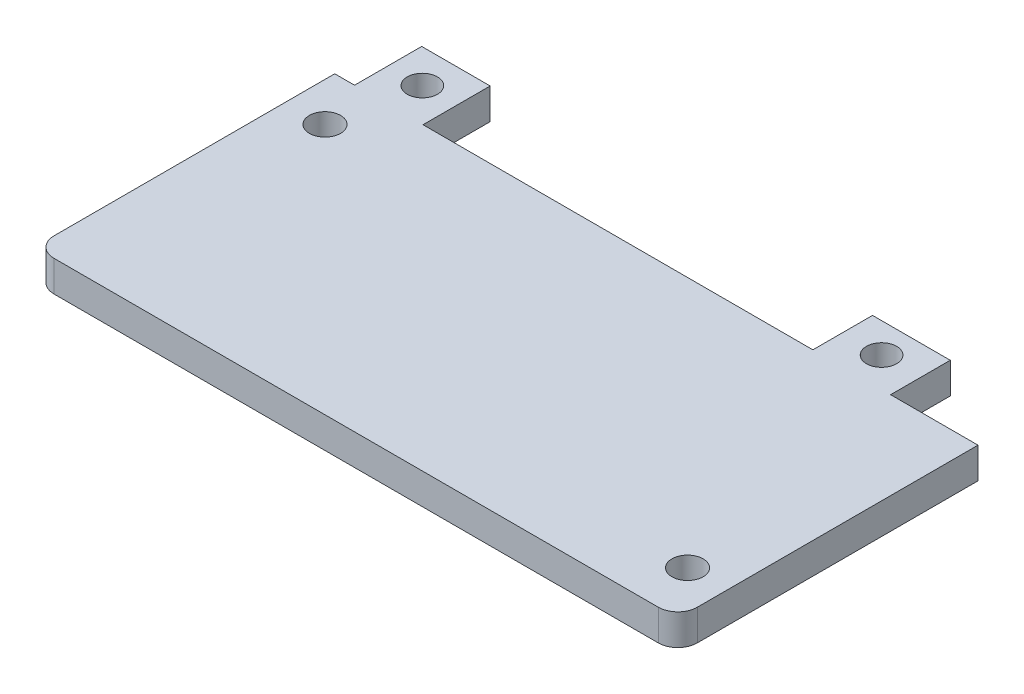
ISO-10303-21;
HEADER;
FILE_DESCRIPTION(('STEP AP214'),'2;1');
FILE_NAME('part.step','',(''),(''),'','','');
FILE_SCHEMA(('AUTOMOTIVE_DESIGN { 1 0 10303 214 1 1 1 1 }'));
ENDSEC;
DATA;
#1=APPLICATION_CONTEXT('core data for automotive mechanical design processes');
#2=APPLICATION_PROTOCOL_DEFINITION('international standard','automotive_design',2000,#1);
#3=PRODUCT_CONTEXT('',#1,'mechanical');
#4=PRODUCT('Part','Part','',(#3));
#5=PRODUCT_RELATED_PRODUCT_CATEGORY('part','',(#4));
#6=PRODUCT_DEFINITION_FORMATION('','',#4);
#7=PRODUCT_DEFINITION_CONTEXT('part definition',#1,'design');
#8=PRODUCT_DEFINITION('design','',#6,#7);
#9=PRODUCT_DEFINITION_SHAPE('','',#8);
#10=(LENGTH_UNIT() NAMED_UNIT(*) SI_UNIT(.MILLI.,.METRE.));
#11=(NAMED_UNIT(*) PLANE_ANGLE_UNIT() SI_UNIT($,.RADIAN.));
#12=(NAMED_UNIT(*) SI_UNIT($,.STERADIAN.) SOLID_ANGLE_UNIT());
#13=UNCERTAINTY_MEASURE_WITH_UNIT(LENGTH_MEASURE(1.E-05),#10,'distance_accuracy_value','');
#14=(GEOMETRIC_REPRESENTATION_CONTEXT(3) GLOBAL_UNCERTAINTY_ASSIGNED_CONTEXT((#13)) GLOBAL_UNIT_ASSIGNED_CONTEXT((#10,
#11,#12)) REPRESENTATION_CONTEXT('',''));
#15=CARTESIAN_POINT('',(0.,0.,0.));
#16=DIRECTION('',(0.,0.,1.));
#17=DIRECTION('',(1.,0.,0.));
#18=AXIS2_PLACEMENT_3D('',#15,#16,#17);
#19=CARTESIAN_POINT('',(0.,3.175,-37.6893567935355));
#20=DIRECTION('',(0.,0.,-1.));
#21=DIRECTION('',(-1.,0.,0.));
#22=AXIS2_PLACEMENT_3D('',#19,#20,#21);
#23=PLANE('',#22);
#24=DIRECTION('',(1.,0.,0.));
#25=VECTOR('',#24,1.);
#26=CARTESIAN_POINT('',(0.,0.,-37.6893567935355));
#27=LINE('',#26,#25);
#28=CARTESIAN_POINT('',(2.03340474937677,0.,-37.6893567935355));
#29=VERTEX_POINT('',#28);
#30=CARTESIAN_POINT('',(9.0585860687994,0.,-37.6893567935355));
#31=VERTEX_POINT('',#30);
#32=EDGE_CURVE('E146',#29,#31,#27,.T.);
#33=ORIENTED_EDGE('',*,*,#32,.F.);
#34=DIRECTION('',(0.,-1.,0.));
#35=VECTOR('',#34,1.);
#36=CARTESIAN_POINT('',(2.03340474937677,3.175,-37.6893567935355));
#37=LINE('',#36,#35);
#38=CARTESIAN_POINT('',(2.03340474937677,3.175,-37.6893567935355));
#39=VERTEX_POINT('',#38);
#40=EDGE_CURVE('E141',#39,#29,#37,.T.);
#41=ORIENTED_EDGE('',*,*,#40,.F.);
#42=DIRECTION('',(1.,0.,0.));
#43=VECTOR('',#42,1.);
#44=CARTESIAN_POINT('',(0.,3.175,-37.6893567935355));
#45=LINE('',#44,#43);
#46=CARTESIAN_POINT('',(9.0585860687994,3.175,-37.6893567935355));
#47=VERTEX_POINT('',#46);
#48=EDGE_CURVE('E144',#39,#47,#45,.T.);
#49=ORIENTED_EDGE('',*,*,#48,.T.);
#50=DIRECTION('',(0.,-1.,0.));
#51=VECTOR('',#50,1.);
#52=CARTESIAN_POINT('',(9.0585860687994,3.175,-37.6893567935355));
#53=LINE('',#52,#51);
#54=EDGE_CURVE('E196',#47,#31,#53,.T.);
#55=ORIENTED_EDGE('',*,*,#54,.T.);
#56=EDGE_LOOP('',(#33,#41,#49,#55));
#57=FACE_BOUND('',#56,.T.);
#58=ADVANCED_FACE('F39',(#57),#23,.T.);
#59=CARTESIAN_POINT('',(2.03340474937678,3.175,0.));
#60=DIRECTION('',(1.,0.,0.));
#61=DIRECTION('',(0.,0.,-1.));
#62=AXIS2_PLACEMENT_3D('',#59,#60,#61);
#63=PLANE('',#62);
#64=DIRECTION('',(0.,0.,1.));
#65=VECTOR('',#64,1.);
#66=CARTESIAN_POINT('',(2.03340474937678,0.,0.));
#67=LINE('',#66,#65);
#68=CARTESIAN_POINT('',(2.03340474937677,0.,-30.8));
#69=VERTEX_POINT('',#68);
#70=EDGE_CURVE('E210',#29,#69,#67,.T.);
#71=ORIENTED_EDGE('',*,*,#70,.T.);
#72=DIRECTION('',(0.,-1.,0.));
#73=VECTOR('',#72,1.);
#74=CARTESIAN_POINT('',(2.03340474937677,3.175,-30.8));
#75=LINE('',#74,#73);
#76=CARTESIAN_POINT('',(2.03340474937677,3.175,-30.8));
#77=VERTEX_POINT('',#76);
#78=EDGE_CURVE('E151',#77,#69,#75,.T.);
#79=ORIENTED_EDGE('',*,*,#78,.F.);
#80=DIRECTION('',(0.,0.,1.));
#81=VECTOR('',#80,1.);
#82=CARTESIAN_POINT('',(2.03340474937678,3.175,0.));
#83=LINE('',#82,#81);
#84=EDGE_CURVE('E155',#39,#77,#83,.T.);
#85=ORIENTED_EDGE('',*,*,#84,.F.);
#86=ORIENTED_EDGE('',*,*,#40,.T.);
#87=EDGE_LOOP('',(#71,#79,#85,#86));
#88=FACE_BOUND('',#87,.T.);
#89=ADVANCED_FACE('F156',(#88),#63,.F.);
#90=CARTESIAN_POINT('',(0.,3.175,-30.8));
#91=DIRECTION('',(0.,0.,1.));
#92=DIRECTION('',(1.,0.,0.));
#93=AXIS2_PLACEMENT_3D('',#90,#91,#92);
#94=PLANE('',#93);
#95=DIRECTION('',(-1.,0.,0.));
#96=VECTOR('',#95,1.);
#97=CARTESIAN_POINT('',(0.,0.,-30.8));
#98=LINE('',#97,#96);
#99=CARTESIAN_POINT('',(0.,0.,-30.8));
#100=VERTEX_POINT('',#99);
#101=EDGE_CURVE('E212',#69,#100,#98,.T.);
#102=ORIENTED_EDGE('',*,*,#101,.T.);
#103=DIRECTION('',(0.,-1.,0.));
#104=VECTOR('',#103,1.);
#105=CARTESIAN_POINT('',(0.,3.175,-30.8));
#106=LINE('',#105,#104);
#107=CARTESIAN_POINT('',(0.,3.175,-30.8));
#108=VERTEX_POINT('',#107);
#109=EDGE_CURVE('E254',#108,#100,#106,.T.);
#110=ORIENTED_EDGE('',*,*,#109,.F.);
#111=DIRECTION('',(-1.,0.,0.));
#112=VECTOR('',#111,1.);
#113=CARTESIAN_POINT('',(0.,3.175,-30.8));
#114=LINE('',#113,#112);
#115=EDGE_CURVE('E160',#77,#108,#114,.T.);
#116=ORIENTED_EDGE('',*,*,#115,.F.);
#117=ORIENTED_EDGE('',*,*,#78,.T.);
#118=EDGE_LOOP('',(#102,#110,#116,#117));
#119=FACE_BOUND('',#118,.T.);
#120=ADVANCED_FACE('F289',(#119),#94,.F.);
#121=CARTESIAN_POINT('',(0.,3.175,0.));
#122=DIRECTION('',(-1.,0.,0.));
#123=DIRECTION('',(0.,0.,1.));
#124=AXIS2_PLACEMENT_3D('',#121,#122,#123);
#125=PLANE('',#124);
#126=DIRECTION('',(0.,0.,-1.));
#127=VECTOR('',#126,1.);
#128=CARTESIAN_POINT('',(0.,0.,0.));
#129=LINE('',#128,#127);
#130=CARTESIAN_POINT('',(0.,0.,-2.));
#131=VERTEX_POINT('',#130);
#132=EDGE_CURVE('E215',#131,#100,#129,.T.);
#133=ORIENTED_EDGE('',*,*,#132,.F.);
#134=DIRECTION('',(0.,-1.,0.));
#135=VECTOR('',#134,1.);
#136=CARTESIAN_POINT('',(0.,3.175,-2.));
#137=LINE('',#136,#135);
#138=CARTESIAN_POINT('',(0.,3.175,-2.));
#139=VERTEX_POINT('',#138);
#140=EDGE_CURVE('E11',#131,#139,#137,.F.);
#141=ORIENTED_EDGE('',*,*,#140,.T.);
#142=DIRECTION('',(0.,0.,-1.));
#143=VECTOR('',#142,1.);
#144=CARTESIAN_POINT('',(0.,3.175,0.));
#145=LINE('',#144,#143);
#146=EDGE_CURVE('E175',#139,#108,#145,.T.);
#147=ORIENTED_EDGE('',*,*,#146,.T.);
#148=ORIENTED_EDGE('',*,*,#109,.T.);
#149=EDGE_LOOP('',(#133,#141,#147,#148));
#150=FACE_BOUND('',#149,.T.);
#151=ADVANCED_FACE('F286',(#150),#125,.T.);
#152=CARTESIAN_POINT('',(0.,3.175,0.));
#153=DIRECTION('',(0.,0.,-1.));
#154=DIRECTION('',(-1.,0.,0.));
#155=AXIS2_PLACEMENT_3D('',#152,#153,#154);
#156=PLANE('',#155);
#157=DIRECTION('',(1.,0.,0.));
#158=VECTOR('',#157,1.);
#159=CARTESIAN_POINT('',(0.,0.,0.));
#160=LINE('',#159,#158);
#161=CARTESIAN_POINT('',(2.,0.,0.));
#162=VERTEX_POINT('',#161);
#163=CARTESIAN_POINT('',(64.,0.,0.));
#164=VERTEX_POINT('',#163);
#165=EDGE_CURVE('E217',#162,#164,#160,.T.);
#166=ORIENTED_EDGE('',*,*,#165,.T.);
#167=DIRECTION('',(0.,-1.,0.));
#168=VECTOR('',#167,1.);
#169=CARTESIAN_POINT('',(64.,3.175,0.));
#170=LINE('',#169,#168);
#171=CARTESIAN_POINT('',(64.,3.175,0.));
#172=VERTEX_POINT('',#171);
#173=EDGE_CURVE('E60',#164,#172,#170,.F.);
#174=ORIENTED_EDGE('',*,*,#173,.T.);
#175=DIRECTION('',(1.,0.,0.));
#176=VECTOR('',#175,1.);
#177=CARTESIAN_POINT('',(0.,3.175,0.));
#178=LINE('',#177,#176);
#179=CARTESIAN_POINT('',(2.,3.175,0.));
#180=VERTEX_POINT('',#179);
#181=EDGE_CURVE('E177',#180,#172,#178,.T.);
#182=ORIENTED_EDGE('',*,*,#181,.F.);
#183=DIRECTION('',(0.,-1.,0.));
#184=VECTOR('',#183,1.);
#185=CARTESIAN_POINT('',(2.,0.,0.));
#186=LINE('',#185,#184);
#187=EDGE_CURVE('E264',#180,#162,#186,.T.);
#188=ORIENTED_EDGE('',*,*,#187,.T.);
#189=EDGE_LOOP('',(#166,#174,#182,#188));
#190=FACE_BOUND('',#189,.T.);
#191=ADVANCED_FACE('F282',(#190),#156,.F.);
#192=CARTESIAN_POINT('',(66.,3.175,0.));
#193=DIRECTION('',(-1.,0.,0.));
#194=DIRECTION('',(0.,0.,1.));
#195=AXIS2_PLACEMENT_3D('',#192,#193,#194);
#196=PLANE('',#195);
#197=DIRECTION('',(0.,0.,-1.));
#198=VECTOR('',#197,1.);
#199=CARTESIAN_POINT('',(66.,3.175,0.));
#200=LINE('',#199,#198);
#201=CARTESIAN_POINT('',(66.,3.175,-2.));
#202=VERTEX_POINT('',#201);
#203=CARTESIAN_POINT('',(66.,3.175,-30.8));
#204=VERTEX_POINT('',#203);
#205=EDGE_CURVE('E179',#202,#204,#200,.T.);
#206=ORIENTED_EDGE('',*,*,#205,.F.);
#207=DIRECTION('',(0.,-1.,0.));
#208=VECTOR('',#207,1.);
#209=CARTESIAN_POINT('',(66.,3.175,-2.));
#210=LINE('',#209,#208);
#211=CARTESIAN_POINT('',(66.,0.,-2.));
#212=VERTEX_POINT('',#211);
#213=EDGE_CURVE('E150',#202,#212,#210,.T.);
#214=ORIENTED_EDGE('',*,*,#213,.T.);
#215=DIRECTION('',(0.,0.,-1.));
#216=VECTOR('',#215,1.);
#217=CARTESIAN_POINT('',(66.,0.,0.));
#218=LINE('',#217,#216);
#219=CARTESIAN_POINT('',(66.,0.,-30.8));
#220=VERTEX_POINT('',#219);
#221=EDGE_CURVE('E219',#212,#220,#218,.T.);
#222=ORIENTED_EDGE('',*,*,#221,.T.);
#223=DIRECTION('',(0.,-1.,0.));
#224=VECTOR('',#223,1.);
#225=CARTESIAN_POINT('',(66.,3.175,-30.8));
#226=LINE('',#225,#224);
#227=EDGE_CURVE('E251',#204,#220,#226,.T.);
#228=ORIENTED_EDGE('',*,*,#227,.F.);
#229=EDGE_LOOP('',(#206,#214,#222,#228));
#230=FACE_BOUND('',#229,.T.);
#231=ADVANCED_FACE('F276',(#230),#196,.F.);
#232=CARTESIAN_POINT('',(0.,3.175,-30.7999999999999));
#233=DIRECTION('',(0.,0.,-1.));
#234=DIRECTION('',(-1.,0.,0.));
#235=AXIS2_PLACEMENT_3D('',#232,#233,#234);
#236=PLANE('',#235);
#237=DIRECTION('',(1.,0.,0.));
#238=VECTOR('',#237,1.);
#239=CARTESIAN_POINT('',(0.,0.,-30.7999999999999));
#240=LINE('',#239,#238);
#241=CARTESIAN_POINT('',(57.0334047493768,0.,-30.8));
#242=VERTEX_POINT('',#241);
#243=EDGE_CURVE('E221',#242,#220,#240,.T.);
#244=ORIENTED_EDGE('',*,*,#243,.F.);
#245=DIRECTION('',(0.,-1.,0.));
#246=VECTOR('',#245,1.);
#247=CARTESIAN_POINT('',(57.0334047493768,3.175,-30.8));
#248=LINE('',#247,#246);
#249=CARTESIAN_POINT('',(57.0334047493768,3.175,-30.8));
#250=VERTEX_POINT('',#249);
#251=EDGE_CURVE('E249',#250,#242,#248,.T.);
#252=ORIENTED_EDGE('',*,*,#251,.F.);
#253=DIRECTION('',(1.,0.,0.));
#254=VECTOR('',#253,1.);
#255=CARTESIAN_POINT('',(0.,3.175,-30.7999999999999));
#256=LINE('',#255,#254);
#257=EDGE_CURVE('E181',#250,#204,#256,.T.);
#258=ORIENTED_EDGE('',*,*,#257,.T.);
#259=ORIENTED_EDGE('',*,*,#227,.T.);
#260=EDGE_LOOP('',(#244,#252,#258,#259));
#261=FACE_BOUND('',#260,.T.);
#262=ADVANCED_FACE('F310',(#261),#236,.T.);
#263=CARTESIAN_POINT('',(57.0334047493768,3.175,0.));
#264=DIRECTION('',(-1.,0.,0.));
#265=DIRECTION('',(0.,0.,1.));
#266=AXIS2_PLACEMENT_3D('',#263,#264,#265);
#267=PLANE('',#266);
#268=DIRECTION('',(0.,0.,-1.));
#269=VECTOR('',#268,1.);
#270=CARTESIAN_POINT('',(57.0334047493768,0.,0.));
#271=LINE('',#270,#269);
#272=CARTESIAN_POINT('',(57.0334047493768,0.,-36.920267815205));
#273=VERTEX_POINT('',#272);
#274=EDGE_CURVE('E224',#242,#273,#271,.T.);
#275=ORIENTED_EDGE('',*,*,#274,.T.);
#276=DIRECTION('',(0.,-1.,0.));
#277=VECTOR('',#276,1.);
#278=CARTESIAN_POINT('',(57.0334047493768,3.175,-36.920267815205));
#279=LINE('',#278,#277);
#280=CARTESIAN_POINT('',(57.0334047493768,3.175,-36.920267815205));
#281=VERTEX_POINT('',#280);
#282=EDGE_CURVE('E247',#281,#273,#279,.T.);
#283=ORIENTED_EDGE('',*,*,#282,.F.);
#284=DIRECTION('',(0.,0.,-1.));
#285=VECTOR('',#284,1.);
#286=CARTESIAN_POINT('',(57.0334047493768,3.175,0.));
#287=LINE('',#286,#285);
#288=EDGE_CURVE('E184',#250,#281,#287,.T.);
#289=ORIENTED_EDGE('',*,*,#288,.F.);
#290=ORIENTED_EDGE('',*,*,#251,.T.);
#291=EDGE_LOOP('',(#275,#283,#289,#290));
#292=FACE_BOUND('',#291,.T.);
#293=ADVANCED_FACE('F308',(#292),#267,.F.);
#294=CARTESIAN_POINT('',(0.,3.175,-36.920267815205));
#295=DIRECTION('',(0.,0.,-1.));
#296=DIRECTION('',(-1.,0.,0.));
#297=AXIS2_PLACEMENT_3D('',#294,#295,#296);
#298=PLANE('',#297);
#299=DIRECTION('',(1.,0.,0.));
#300=VECTOR('',#299,1.);
#301=CARTESIAN_POINT('',(0.,0.,-36.920267815205));
#302=LINE('',#301,#300);
#303=CARTESIAN_POINT('',(49.0585860687994,0.,-36.920267815205));
#304=VERTEX_POINT('',#303);
#305=EDGE_CURVE('E227',#304,#273,#302,.T.);
#306=ORIENTED_EDGE('',*,*,#305,.F.);
#307=DIRECTION('',(0.,-1.,0.));
#308=VECTOR('',#307,1.);
#309=CARTESIAN_POINT('',(49.0585860687994,3.175,-36.920267815205));
#310=LINE('',#309,#308);
#311=CARTESIAN_POINT('',(49.0585860687994,3.175,-36.920267815205));
#312=VERTEX_POINT('',#311);
#313=EDGE_CURVE('E245',#312,#304,#310,.T.);
#314=ORIENTED_EDGE('',*,*,#313,.F.);
#315=DIRECTION('',(1.,0.,0.));
#316=VECTOR('',#315,1.);
#317=CARTESIAN_POINT('',(0.,3.175,-36.920267815205));
#318=LINE('',#317,#316);
#319=EDGE_CURVE('E186',#312,#281,#318,.T.);
#320=ORIENTED_EDGE('',*,*,#319,.T.);
#321=ORIENTED_EDGE('',*,*,#282,.T.);
#322=EDGE_LOOP('',(#306,#314,#320,#321));
#323=FACE_BOUND('',#322,.T.);
#324=ADVANCED_FACE('F303',(#323),#298,.T.);
#325=CARTESIAN_POINT('',(49.0585860687994,3.175,0.));
#326=DIRECTION('',(-1.,0.,0.));
#327=DIRECTION('',(0.,0.,1.));
#328=AXIS2_PLACEMENT_3D('',#325,#326,#327);
#329=PLANE('',#328);
#330=DIRECTION('',(0.,0.,-1.));
#331=VECTOR('',#330,1.);
#332=CARTESIAN_POINT('',(49.0585860687994,0.,0.));
#333=LINE('',#332,#331);
#334=CARTESIAN_POINT('',(49.0585860687994,0.,-30.8));
#335=VERTEX_POINT('',#334);
#336=EDGE_CURVE('E230',#335,#304,#333,.T.);
#337=ORIENTED_EDGE('',*,*,#336,.F.);
#338=DIRECTION('',(0.,-1.,0.));
#339=VECTOR('',#338,1.);
#340=CARTESIAN_POINT('',(49.0585860687994,3.175,-30.8));
#341=LINE('',#340,#339);
#342=CARTESIAN_POINT('',(49.0585860687994,3.175,-30.8));
#343=VERTEX_POINT('',#342);
#344=EDGE_CURVE('E243',#343,#335,#341,.T.);
#345=ORIENTED_EDGE('',*,*,#344,.F.);
#346=DIRECTION('',(0.,0.,-1.));
#347=VECTOR('',#346,1.);
#348=CARTESIAN_POINT('',(49.0585860687994,3.175,0.));
#349=LINE('',#348,#347);
#350=EDGE_CURVE('E189',#343,#312,#349,.T.);
#351=ORIENTED_EDGE('',*,*,#350,.T.);
#352=ORIENTED_EDGE('',*,*,#313,.T.);
#353=EDGE_LOOP('',(#337,#345,#351,#352));
#354=FACE_BOUND('',#353,.T.);
#355=ADVANCED_FACE('F298',(#354),#329,.T.);
#356=CARTESIAN_POINT('',(0.,3.175,-30.8));
#357=DIRECTION('',(0.,0.,-1.));
#358=DIRECTION('',(-1.,0.,0.));
#359=AXIS2_PLACEMENT_3D('',#356,#357,#358);
#360=PLANE('',#359);
#361=DIRECTION('',(1.,0.,0.));
#362=VECTOR('',#361,1.);
#363=CARTESIAN_POINT('',(0.,0.,-30.8));
#364=LINE('',#363,#362);
#365=CARTESIAN_POINT('',(9.0585860687994,0.,-30.8));
#366=VERTEX_POINT('',#365);
#367=EDGE_CURVE('E233',#366,#335,#364,.T.);
#368=ORIENTED_EDGE('',*,*,#367,.F.);
#369=DIRECTION('',(0.,-1.,0.));
#370=VECTOR('',#369,1.);
#371=CARTESIAN_POINT('',(9.0585860687994,3.175,-30.8));
#372=LINE('',#371,#370);
#373=CARTESIAN_POINT('',(9.0585860687994,3.175,-30.8));
#374=VERTEX_POINT('',#373);
#375=EDGE_CURVE('E241',#374,#366,#372,.T.);
#376=ORIENTED_EDGE('',*,*,#375,.F.);
#377=DIRECTION('',(1.,0.,0.));
#378=VECTOR('',#377,1.);
#379=CARTESIAN_POINT('',(0.,3.175,-30.8));
#380=LINE('',#379,#378);
#381=EDGE_CURVE('E192',#374,#343,#380,.T.);
#382=ORIENTED_EDGE('',*,*,#381,.T.);
#383=ORIENTED_EDGE('',*,*,#344,.T.);
#384=EDGE_LOOP('',(#368,#376,#382,#383));
#385=FACE_BOUND('',#384,.T.);
#386=ADVANCED_FACE('F294',(#385),#360,.T.);
#387=CARTESIAN_POINT('',(62.,3.175,-5.));
#388=DIRECTION('',(0.,-1.,0.));
#389=DIRECTION('',(0.,0.,-1.));
#390=AXIS2_PLACEMENT_3D('',#387,#388,#389);
#391=CYLINDRICAL_SURFACE('',#390,1.60000000000001);
#392=CARTESIAN_POINT('',(62.,3.175,-5.));
#393=DIRECTION('',(0.,1.,0.));
#394=DIRECTION('',(0.,0.,1.));
#395=AXIS2_PLACEMENT_3D('',#392,#393,#394);
#396=CIRCLE('',#395,1.60000000000001);
#397=CARTESIAN_POINT('',(62.,3.175,-3.4));
#398=VERTEX_POINT('',#397);
#399=EDGE_CURVE('E167',#398,#398,#396,.T.);
#400=ORIENTED_EDGE('',*,*,#399,.T.);
#401=EDGE_LOOP('',(#400));
#402=FACE_BOUND('',#401,.T.);
#403=CARTESIAN_POINT('',(62.,0.,-5.));
#404=DIRECTION('',(0.,1.,0.));
#405=DIRECTION('',(0.,0.,1.));
#406=AXIS2_PLACEMENT_3D('',#403,#404,#405);
#407=CIRCLE('',#406,1.60000000000001);
#408=CARTESIAN_POINT('',(62.,0.,-3.4));
#409=VERTEX_POINT('',#408);
#410=EDGE_CURVE('E206',#409,#409,#407,.T.);
#411=ORIENTED_EDGE('',*,*,#410,.F.);
#412=EDGE_LOOP('',(#411));
#413=FACE_BOUND('',#412,.T.);
#414=ADVANCED_FACE('F327',(#402,#413),#391,.F.);
#415=CARTESIAN_POINT('',(4.,3.175,-25.8));
#416=DIRECTION('',(0.,-1.,0.));
#417=DIRECTION('',(0.,0.,-1.));
#418=AXIS2_PLACEMENT_3D('',#415,#416,#417);
#419=CYLINDRICAL_SURFACE('',#418,1.6);
#420=CARTESIAN_POINT('',(4.,3.175,-25.8));
#421=DIRECTION('',(0.,1.,0.));
#422=DIRECTION('',(0.,0.,1.));
#423=AXIS2_PLACEMENT_3D('',#420,#421,#422);
#424=CIRCLE('',#423,1.6);
#425=CARTESIAN_POINT('',(4.,3.175,-24.2));
#426=VERTEX_POINT('',#425);
#427=EDGE_CURVE('E170',#426,#426,#424,.T.);
#428=ORIENTED_EDGE('',*,*,#427,.T.);
#429=EDGE_LOOP('',(#428));
#430=FACE_BOUND('',#429,.T.);
#431=CARTESIAN_POINT('',(4.,0.,-25.8));
#432=DIRECTION('',(0.,1.,0.));
#433=DIRECTION('',(0.,0.,1.));
#434=AXIS2_PLACEMENT_3D('',#431,#432,#433);
#435=CIRCLE('',#434,1.6);
#436=CARTESIAN_POINT('',(4.,0.,-24.2));
#437=VERTEX_POINT('',#436);
#438=EDGE_CURVE('E203',#437,#437,#435,.T.);
#439=ORIENTED_EDGE('',*,*,#438,.F.);
#440=EDGE_LOOP('',(#439));
#441=FACE_BOUND('',#440,.T.);
#442=ADVANCED_FACE('F330',(#430,#441),#419,.F.);
#443=CARTESIAN_POINT('',(5.54599540908809,3.175,-34.2446783967677));
#444=DIRECTION('',(0.,-1.,0.));
#445=DIRECTION('',(0.,0.,-1.));
#446=AXIS2_PLACEMENT_3D('',#443,#444,#445);
#447=CYLINDRICAL_SURFACE('',#446,1.55000000818247);
#448=CARTESIAN_POINT('',(5.54599540908809,3.175,-34.2446783967677));
#449=DIRECTION('',(0.,1.,0.));
#450=DIRECTION('',(0.,0.,1.));
#451=AXIS2_PLACEMENT_3D('',#448,#449,#450);
#452=CIRCLE('',#451,1.55000000818247);
#453=CARTESIAN_POINT('',(5.54599540908809,3.175,-32.6946783885853));
#454=VERTEX_POINT('',#453);
#455=EDGE_CURVE('E543',#454,#454,#452,.T.);
#456=ORIENTED_EDGE('',*,*,#455,.T.);
#457=EDGE_LOOP('',(#456));
#458=FACE_BOUND('',#457,.T.);
#459=CARTESIAN_POINT('',(5.54599540908809,0.,-34.2446783967677));
#460=DIRECTION('',(0.,1.,0.));
#461=DIRECTION('',(0.,0.,1.));
#462=AXIS2_PLACEMENT_3D('',#459,#460,#461);
#463=CIRCLE('',#462,1.55000000818247);
#464=CARTESIAN_POINT('',(5.54599540908809,0.,-32.6946783885853));
#465=VERTEX_POINT('',#464);
#466=EDGE_CURVE('E200',#465,#465,#463,.T.);
#467=ORIENTED_EDGE('',*,*,#466,.F.);
#468=EDGE_LOOP('',(#467));
#469=FACE_BOUND('',#468,.T.);
#470=ADVANCED_FACE('F334',(#458,#469),#447,.F.);
#471=CARTESIAN_POINT('',(53.0459954090881,3.175,-33.8601339076025));
#472=DIRECTION('',(0.,-1.,0.));
#473=DIRECTION('',(0.,0.,-1.));
#474=AXIS2_PLACEMENT_3D('',#471,#472,#473);
#475=CYLINDRICAL_SURFACE('',#474,1.55);
#476=CARTESIAN_POINT('',(53.0459954090881,3.175,-33.8601339076025));
#477=DIRECTION('',(0.,1.,0.));
#478=DIRECTION('',(0.,0.,1.));
#479=AXIS2_PLACEMENT_3D('',#476,#477,#478);
#480=CIRCLE('',#479,1.55);
#481=CARTESIAN_POINT('',(53.0459954090881,3.175,-32.3101339076025));
#482=VERTEX_POINT('',#481);
#483=EDGE_CURVE('E239',#482,#482,#480,.T.);
#484=ORIENTED_EDGE('',*,*,#483,.T.);
#485=EDGE_LOOP('',(#484));
#486=FACE_BOUND('',#485,.T.);
#487=CARTESIAN_POINT('',(53.0459954090881,0.,-33.8601339076025));
#488=DIRECTION('',(0.,1.,0.));
#489=DIRECTION('',(0.,0.,1.));
#490=AXIS2_PLACEMENT_3D('',#487,#488,#489);
#491=CIRCLE('',#490,1.55);
#492=CARTESIAN_POINT('',(53.0459954090881,0.,-32.3101339076025));
#493=VERTEX_POINT('',#492);
#494=EDGE_CURVE('E197',#493,#493,#491,.T.);
#495=ORIENTED_EDGE('',*,*,#494,.F.);
#496=EDGE_LOOP('',(#495));
#497=FACE_BOUND('',#496,.T.);
#498=ADVANCED_FACE('F338',(#486,#497),#475,.F.);
#499=CARTESIAN_POINT('',(9.0585860687994,3.175,0.));
#500=DIRECTION('',(-1.,0.,0.));
#501=DIRECTION('',(0.,0.,1.));
#502=AXIS2_PLACEMENT_3D('',#499,#500,#501);
#503=PLANE('',#502);
#504=DIRECTION('',(0.,0.,-1.));
#505=VECTOR('',#504,1.);
#506=CARTESIAN_POINT('',(9.0585860687994,0.,0.));
#507=LINE('',#506,#505);
#508=EDGE_CURVE('E236',#366,#31,#507,.T.);
#509=ORIENTED_EDGE('',*,*,#508,.T.);
#510=ORIENTED_EDGE('',*,*,#54,.F.);
#511=DIRECTION('',(0.,0.,-1.));
#512=VECTOR('',#511,1.);
#513=CARTESIAN_POINT('',(9.0585860687994,3.175,0.));
#514=LINE('',#513,#512);
#515=EDGE_CURVE('E165',#374,#47,#514,.T.);
#516=ORIENTED_EDGE('',*,*,#515,.F.);
#517=ORIENTED_EDGE('',*,*,#375,.T.);
#518=EDGE_LOOP('',(#509,#510,#516,#517));
#519=FACE_BOUND('',#518,.T.);
#520=ADVANCED_FACE('F341',(#519),#503,.F.);
#521=CARTESIAN_POINT('',(0.,3.175,0.));
#522=DIRECTION('',(0.,1.,0.));
#523=DIRECTION('',(0.,0.,1.));
#524=AXIS2_PLACEMENT_3D('',#521,#522,#523);
#525=PLANE('',#524);
#526=ORIENTED_EDGE('',*,*,#483,.F.);
#527=EDGE_LOOP('',(#526));
#528=FACE_BOUND('',#527,.T.);
#529=ORIENTED_EDGE('',*,*,#455,.F.);
#530=EDGE_LOOP('',(#529));
#531=FACE_BOUND('',#530,.T.);
#532=ORIENTED_EDGE('',*,*,#427,.F.);
#533=EDGE_LOOP('',(#532));
#534=FACE_BOUND('',#533,.T.);
#535=ORIENTED_EDGE('',*,*,#399,.F.);
#536=EDGE_LOOP('',(#535));
#537=FACE_BOUND('',#536,.T.);
#538=ORIENTED_EDGE('',*,*,#181,.T.);
#539=CARTESIAN_POINT('',(64.,3.175,-2.));
#540=DIRECTION('',(0.,1.,0.));
#541=DIRECTION('',(0.,0.,1.));
#542=AXIS2_PLACEMENT_3D('',#539,#540,#541);
#543=CIRCLE('',#542,2.);
#544=EDGE_CURVE('E47',#172,#202,#543,.T.);
#545=ORIENTED_EDGE('',*,*,#544,.T.);
#546=ORIENTED_EDGE('',*,*,#205,.T.);
#547=ORIENTED_EDGE('',*,*,#257,.F.);
#548=ORIENTED_EDGE('',*,*,#288,.T.);
#549=ORIENTED_EDGE('',*,*,#319,.F.);
#550=ORIENTED_EDGE('',*,*,#350,.F.);
#551=ORIENTED_EDGE('',*,*,#381,.F.);
#552=ORIENTED_EDGE('',*,*,#515,.T.);
#553=ORIENTED_EDGE('',*,*,#48,.F.);
#554=ORIENTED_EDGE('',*,*,#84,.T.);
#555=ORIENTED_EDGE('',*,*,#115,.T.);
#556=ORIENTED_EDGE('',*,*,#146,.F.);
#557=CARTESIAN_POINT('',(2.,3.175,-2.));
#558=DIRECTION('',(0.,1.,0.));
#559=DIRECTION('',(0.,0.,1.));
#560=AXIS2_PLACEMENT_3D('',#557,#558,#559);
#561=CIRCLE('',#560,2.);
#562=EDGE_CURVE('E268',#139,#180,#561,.T.);
#563=ORIENTED_EDGE('',*,*,#562,.T.);
#564=EDGE_LOOP('',(#538,#545,#546,#547,#548,#549,#550,#551,#552,#553,#554,#555,#556,#563));
#565=FACE_BOUND('',#564,.T.);
#566=ADVANCED_FACE('F162',(#528,#531,#534,#537,#565),#525,.T.);
#567=CARTESIAN_POINT('',(0.,0.,0.));
#568=DIRECTION('',(0.,1.,0.));
#569=DIRECTION('',(0.,0.,1.));
#570=AXIS2_PLACEMENT_3D('',#567,#568,#569);
#571=PLANE('',#570);
#572=ORIENTED_EDGE('',*,*,#494,.T.);
#573=EDGE_LOOP('',(#572));
#574=FACE_BOUND('',#573,.T.);
#575=ORIENTED_EDGE('',*,*,#466,.T.);
#576=EDGE_LOOP('',(#575));
#577=FACE_BOUND('',#576,.T.);
#578=ORIENTED_EDGE('',*,*,#438,.T.);
#579=EDGE_LOOP('',(#578));
#580=FACE_BOUND('',#579,.T.);
#581=ORIENTED_EDGE('',*,*,#410,.T.);
#582=EDGE_LOOP('',(#581));
#583=FACE_BOUND('',#582,.T.);
#584=ORIENTED_EDGE('',*,*,#221,.F.);
#585=CARTESIAN_POINT('',(64.,0.,-2.));
#586=DIRECTION('',(0.,1.,0.));
#587=DIRECTION('',(0.,0.,1.));
#588=AXIS2_PLACEMENT_3D('',#585,#586,#587);
#589=CIRCLE('',#588,2.);
#590=EDGE_CURVE('E262',#212,#164,#589,.F.);
#591=ORIENTED_EDGE('',*,*,#590,.T.);
#592=ORIENTED_EDGE('',*,*,#165,.F.);
#593=CARTESIAN_POINT('',(2.,0.,-2.));
#594=DIRECTION('',(0.,1.,0.));
#595=DIRECTION('',(0.,0.,1.));
#596=AXIS2_PLACEMENT_3D('',#593,#594,#595);
#597=CIRCLE('',#596,2.);
#598=EDGE_CURVE('E260',#162,#131,#597,.F.);
#599=ORIENTED_EDGE('',*,*,#598,.T.);
#600=ORIENTED_EDGE('',*,*,#132,.T.);
#601=ORIENTED_EDGE('',*,*,#101,.F.);
#602=ORIENTED_EDGE('',*,*,#70,.F.);
#603=ORIENTED_EDGE('',*,*,#32,.T.);
#604=ORIENTED_EDGE('',*,*,#508,.F.);
#605=ORIENTED_EDGE('',*,*,#367,.T.);
#606=ORIENTED_EDGE('',*,*,#336,.T.);
#607=ORIENTED_EDGE('',*,*,#305,.T.);
#608=ORIENTED_EDGE('',*,*,#274,.F.);
#609=ORIENTED_EDGE('',*,*,#243,.T.);
#610=EDGE_LOOP('',(#584,#591,#592,#599,#600,#601,#602,#603,#604,#605,#606,#607,#608,#609));
#611=FACE_BOUND('',#610,.T.);
#612=ADVANCED_FACE('F281',(#574,#577,#580,#583,#611),#571,.F.);
#613=CARTESIAN_POINT('',(64.,3.175,-2.));
#614=DIRECTION('',(0.,-1.,0.));
#615=DIRECTION('',(0.,0.,-1.));
#616=AXIS2_PLACEMENT_3D('',#613,#614,#615);
#617=CYLINDRICAL_SURFACE('',#616,2.);
#618=ORIENTED_EDGE('',*,*,#544,.F.);
#619=ORIENTED_EDGE('',*,*,#173,.F.);
#620=ORIENTED_EDGE('',*,*,#590,.F.);
#621=ORIENTED_EDGE('',*,*,#213,.F.);
#622=EDGE_LOOP('',(#618,#619,#620,#621));
#623=FACE_BOUND('',#622,.T.);
#624=ADVANCED_FACE('F278',(#623),#617,.T.);
#625=CARTESIAN_POINT('',(2.,3.175,-2.));
#626=DIRECTION('',(0.,1.,0.));
#627=DIRECTION('',(0.,0.,1.));
#628=AXIS2_PLACEMENT_3D('',#625,#626,#627);
#629=CYLINDRICAL_SURFACE('',#628,2.);
#630=ORIENTED_EDGE('',*,*,#562,.F.);
#631=ORIENTED_EDGE('',*,*,#140,.F.);
#632=ORIENTED_EDGE('',*,*,#598,.F.);
#633=ORIENTED_EDGE('',*,*,#187,.F.);
#634=EDGE_LOOP('',(#630,#631,#632,#633));
#635=FACE_BOUND('',#634,.T.);
#636=ADVANCED_FACE('F41',(#635),#629,.T.);
#637=CLOSED_SHELL('',(#58,#89,#120,#151,#191,#231,#262,#293,#324,#355,#386,#414,#442,#470,#498,
#520,#566,#612,#624,#636));
#638=MANIFOLD_SOLID_BREP('B2',#637);
#639=ADVANCED_BREP_SHAPE_REPRESENTATION('',(#18,#638),#14);
#640=SHAPE_DEFINITION_REPRESENTATION(#9,#639);
ENDSEC;
END-ISO-10303-21;
